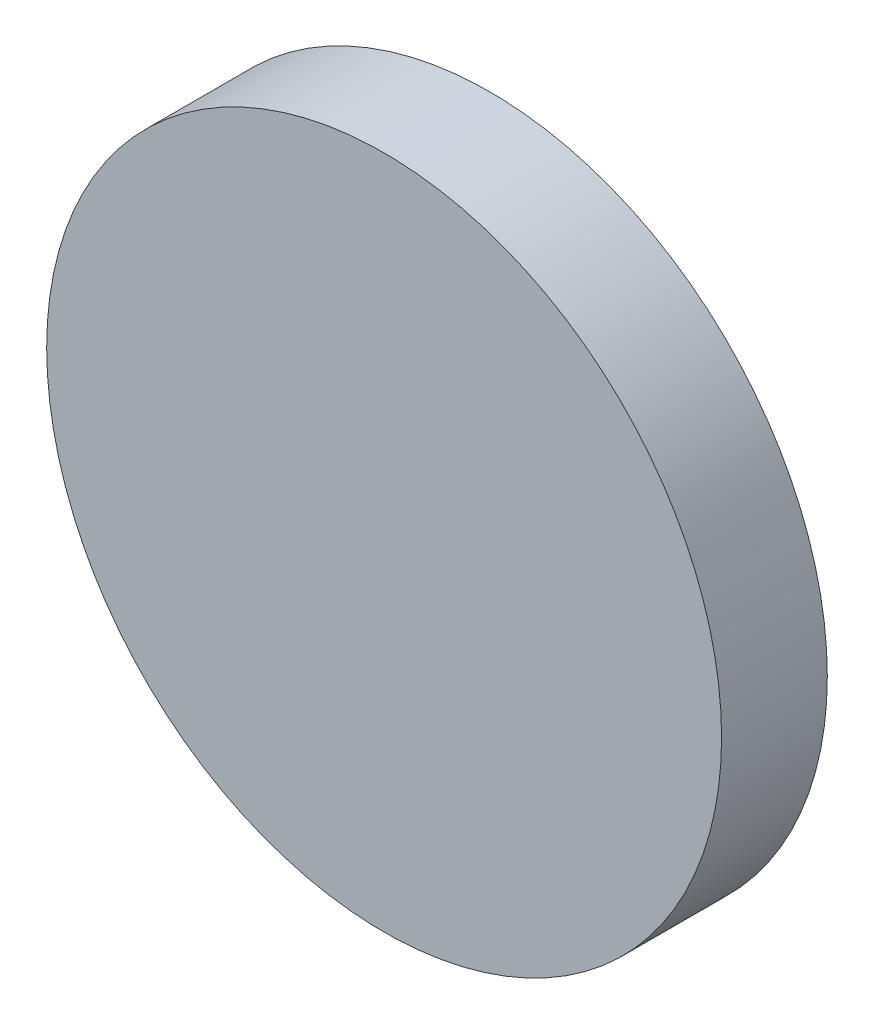
ISO-10303-21;
HEADER;
FILE_DESCRIPTION(('STEP AP214'),'2;1');
FILE_NAME('part.step','',(''),(''),'','','');
FILE_SCHEMA(('AUTOMOTIVE_DESIGN { 1 0 10303 214 1 1 1 1 }'));
ENDSEC;
DATA;
#1=APPLICATION_CONTEXT('core data for automotive mechanical design processes');
#2=APPLICATION_PROTOCOL_DEFINITION('international standard','automotive_design',2000,#1);
#3=PRODUCT_CONTEXT('',#1,'mechanical');
#4=PRODUCT('Part','Part','',(#3));
#5=PRODUCT_RELATED_PRODUCT_CATEGORY('part','',(#4));
#6=PRODUCT_DEFINITION_FORMATION('','',#4);
#7=PRODUCT_DEFINITION_CONTEXT('part definition',#1,'design');
#8=PRODUCT_DEFINITION('design','',#6,#7);
#9=PRODUCT_DEFINITION_SHAPE('','',#8);
#10=(LENGTH_UNIT() NAMED_UNIT(*) SI_UNIT(.MILLI.,.METRE.));
#11=(NAMED_UNIT(*) PLANE_ANGLE_UNIT() SI_UNIT($,.RADIAN.));
#12=(NAMED_UNIT(*) SI_UNIT($,.STERADIAN.) SOLID_ANGLE_UNIT());
#13=UNCERTAINTY_MEASURE_WITH_UNIT(LENGTH_MEASURE(1.E-05),#10,'distance_accuracy_value','');
#14=(GEOMETRIC_REPRESENTATION_CONTEXT(3) GLOBAL_UNCERTAINTY_ASSIGNED_CONTEXT((#13)) GLOBAL_UNIT_ASSIGNED_CONTEXT((#10,
#11,#12)) REPRESENTATION_CONTEXT('',''));
#15=CARTESIAN_POINT('',(0.,0.,0.));
#16=DIRECTION('',(0.,0.,1.));
#17=DIRECTION('',(1.,0.,0.));
#18=AXIS2_PLACEMENT_3D('',#15,#16,#17);
#19=CARTESIAN_POINT('',(0.,0.,4.7));
#20=DIRECTION('',(0.,0.,-1.));
#21=DIRECTION('',(-1.,0.,0.));
#22=AXIS2_PLACEMENT_3D('',#19,#20,#21);
#23=CYLINDRICAL_SURFACE('',#22,15.);
#24=CARTESIAN_POINT('',(0.,0.,4.7));
#25=DIRECTION('',(0.,0.,1.));
#26=DIRECTION('',(1.,0.,0.));
#27=AXIS2_PLACEMENT_3D('',#24,#25,#26);
#28=CIRCLE('',#27,15.);
#29=CARTESIAN_POINT('',(15.,0.,4.7));
#30=VERTEX_POINT('',#29);
#31=EDGE_CURVE('E10',#30,#30,#28,.T.);
#32=ORIENTED_EDGE('',*,*,#31,.F.);
#33=EDGE_LOOP('',(#32));
#34=FACE_BOUND('',#33,.T.);
#35=CARTESIAN_POINT('',(0.,0.,0.));
#36=DIRECTION('',(0.,0.,1.));
#37=DIRECTION('',(1.,0.,0.));
#38=AXIS2_PLACEMENT_3D('',#35,#36,#37);
#39=CIRCLE('',#38,15.);
#40=CARTESIAN_POINT('',(15.,0.,0.));
#41=VERTEX_POINT('',#40);
#42=EDGE_CURVE('E37',#41,#41,#39,.T.);
#43=ORIENTED_EDGE('',*,*,#42,.T.);
#44=EDGE_LOOP('',(#43));
#45=FACE_BOUND('',#44,.T.);
#46=ADVANCED_FACE('F40',(#34,#45),#23,.T.);
#47=CARTESIAN_POINT('',(0.,0.,4.7));
#48=DIRECTION('',(0.,0.,1.));
#49=DIRECTION('',(1.,0.,0.));
#50=AXIS2_PLACEMENT_3D('',#47,#48,#49);
#51=PLANE('',#50);
#52=ORIENTED_EDGE('',*,*,#31,.T.);
#53=EDGE_LOOP('',(#52));
#54=FACE_BOUND('',#53,.T.);
#55=ADVANCED_FACE('F55',(#54),#51,.T.);
#56=CARTESIAN_POINT('',(0.,0.,0.));
#57=DIRECTION('',(0.,0.,1.));
#58=DIRECTION('',(1.,0.,0.));
#59=AXIS2_PLACEMENT_3D('',#56,#57,#58);
#60=PLANE('',#59);
#61=ORIENTED_EDGE('',*,*,#42,.F.);
#62=EDGE_LOOP('',(#61));
#63=FACE_BOUND('',#62,.T.);
#64=ADVANCED_FACE('F49',(#63),#60,.F.);
#65=CLOSED_SHELL('',(#46,#55,#64));
#66=MANIFOLD_SOLID_BREP('B2',#65);
#67=ADVANCED_BREP_SHAPE_REPRESENTATION('',(#18,#66),#14);
#68=SHAPE_DEFINITION_REPRESENTATION(#9,#67);
ENDSEC;
END-ISO-10303-21;
